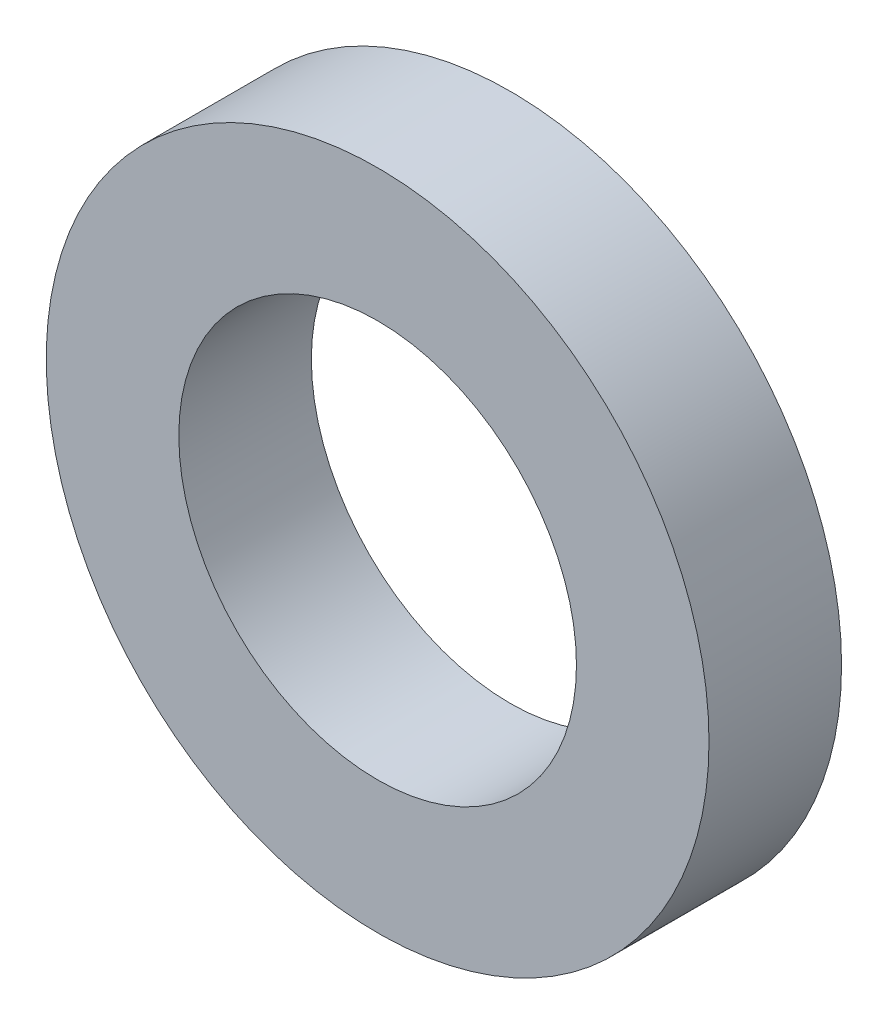
ISO-10303-21;
HEADER;
FILE_DESCRIPTION(('STEP AP214'),'2;1');
FILE_NAME('part.step','',(''),(''),'','','');
FILE_SCHEMA(('AUTOMOTIVE_DESIGN { 1 0 10303 214 1 1 1 1 }'));
ENDSEC;
DATA;
#1=APPLICATION_CONTEXT('core data for automotive mechanical design processes');
#2=APPLICATION_PROTOCOL_DEFINITION('international standard','automotive_design',2000,#1);
#3=PRODUCT_CONTEXT('',#1,'mechanical');
#4=PRODUCT('Part','Part','',(#3));
#5=PRODUCT_RELATED_PRODUCT_CATEGORY('part','',(#4));
#6=PRODUCT_DEFINITION_FORMATION('','',#4);
#7=PRODUCT_DEFINITION_CONTEXT('part definition',#1,'design');
#8=PRODUCT_DEFINITION('design','',#6,#7);
#9=PRODUCT_DEFINITION_SHAPE('','',#8);
#10=(LENGTH_UNIT() NAMED_UNIT(*) SI_UNIT(.MILLI.,.METRE.));
#11=(NAMED_UNIT(*) PLANE_ANGLE_UNIT() SI_UNIT($,.RADIAN.));
#12=(NAMED_UNIT(*) SI_UNIT($,.STERADIAN.) SOLID_ANGLE_UNIT());
#13=UNCERTAINTY_MEASURE_WITH_UNIT(LENGTH_MEASURE(1.E-05),#10,'distance_accuracy_value','');
#14=(GEOMETRIC_REPRESENTATION_CONTEXT(3) GLOBAL_UNCERTAINTY_ASSIGNED_CONTEXT((#13)) GLOBAL_UNIT_ASSIGNED_CONTEXT((#10,
#11,#12)) REPRESENTATION_CONTEXT('',''));
#15=CARTESIAN_POINT('',(0.,0.,0.));
#16=DIRECTION('',(0.,0.,1.));
#17=DIRECTION('',(1.,0.,0.));
#18=AXIS2_PLACEMENT_3D('',#15,#16,#17);
#19=CARTESIAN_POINT('',(0.,0.,1.));
#20=DIRECTION('',(0.,0.,1.));
#21=DIRECTION('',(1.,0.,0.));
#22=AXIS2_PLACEMENT_3D('',#19,#20,#21);
#23=PLANE('',#22);
#24=CARTESIAN_POINT('',(0.,0.,1.));
#25=DIRECTION('',(0.,0.,1.));
#26=DIRECTION('',(1.,0.,0.));
#27=AXIS2_PLACEMENT_3D('',#24,#25,#26);
#28=CIRCLE('',#27,2.5);
#29=CARTESIAN_POINT('',(2.5,0.,1.));
#30=VERTEX_POINT('',#29);
#31=EDGE_CURVE('E10',#30,#30,#28,.T.);
#32=ORIENTED_EDGE('',*,*,#31,.T.);
#33=EDGE_LOOP('',(#32));
#34=FACE_BOUND('',#33,.T.);
#35=CARTESIAN_POINT('',(0.,0.,1.));
#36=DIRECTION('',(0.,0.,1.));
#37=DIRECTION('',(1.,0.,0.));
#38=AXIS2_PLACEMENT_3D('',#35,#36,#37);
#39=CIRCLE('',#38,1.5);
#40=CARTESIAN_POINT('',(1.5,0.,1.));
#41=VERTEX_POINT('',#40);
#42=EDGE_CURVE('E56',#41,#41,#39,.T.);
#43=ORIENTED_EDGE('',*,*,#42,.F.);
#44=EDGE_LOOP('',(#43));
#45=FACE_BOUND('',#44,.T.);
#46=ADVANCED_FACE('F43',(#34,#45),#23,.T.);
#47=CARTESIAN_POINT('',(0.,0.,0.));
#48=DIRECTION('',(0.,0.,1.));
#49=DIRECTION('',(1.,0.,0.));
#50=AXIS2_PLACEMENT_3D('',#47,#48,#49);
#51=PLANE('',#50);
#52=CARTESIAN_POINT('',(0.,0.,0.));
#53=DIRECTION('',(0.,0.,1.));
#54=DIRECTION('',(1.,0.,0.));
#55=AXIS2_PLACEMENT_3D('',#52,#53,#54);
#56=CIRCLE('',#55,2.5);
#57=CARTESIAN_POINT('',(2.5,0.,0.));
#58=VERTEX_POINT('',#57);
#59=EDGE_CURVE('E47',#58,#58,#56,.T.);
#60=ORIENTED_EDGE('',*,*,#59,.F.);
#61=EDGE_LOOP('',(#60));
#62=FACE_BOUND('',#61,.T.);
#63=CARTESIAN_POINT('',(0.,0.,0.));
#64=DIRECTION('',(0.,0.,1.));
#65=DIRECTION('',(1.,0.,0.));
#66=AXIS2_PLACEMENT_3D('',#63,#64,#65);
#67=CIRCLE('',#66,1.5);
#68=CARTESIAN_POINT('',(1.5,0.,0.));
#69=VERTEX_POINT('',#68);
#70=EDGE_CURVE('E58',#69,#69,#67,.T.);
#71=ORIENTED_EDGE('',*,*,#70,.T.);
#72=EDGE_LOOP('',(#71));
#73=FACE_BOUND('',#72,.T.);
#74=ADVANCED_FACE('F70',(#62,#73),#51,.F.);
#75=CARTESIAN_POINT('',(0.,0.,1.));
#76=DIRECTION('',(0.,0.,-1.));
#77=DIRECTION('',(-1.,0.,0.));
#78=AXIS2_PLACEMENT_3D('',#75,#76,#77);
#79=CYLINDRICAL_SURFACE('',#78,2.5);
#80=ORIENTED_EDGE('',*,*,#31,.F.);
#81=EDGE_LOOP('',(#80));
#82=FACE_BOUND('',#81,.T.);
#83=ORIENTED_EDGE('',*,*,#59,.T.);
#84=EDGE_LOOP('',(#83));
#85=FACE_BOUND('',#84,.T.);
#86=ADVANCED_FACE('F45',(#82,#85),#79,.T.);
#87=CARTESIAN_POINT('',(0.,0.,1.));
#88=DIRECTION('',(0.,0.,-1.));
#89=DIRECTION('',(-1.,0.,0.));
#90=AXIS2_PLACEMENT_3D('',#87,#88,#89);
#91=CYLINDRICAL_SURFACE('',#90,1.5);
#92=ORIENTED_EDGE('',*,*,#42,.T.);
#93=EDGE_LOOP('',(#92));
#94=FACE_BOUND('',#93,.T.);
#95=ORIENTED_EDGE('',*,*,#70,.F.);
#96=EDGE_LOOP('',(#95));
#97=FACE_BOUND('',#96,.T.);
#98=ADVANCED_FACE('F66',(#94,#97),#91,.F.);
#99=CLOSED_SHELL('',(#46,#74,#86,#98));
#100=MANIFOLD_SOLID_BREP('B2',#99);
#101=ADVANCED_BREP_SHAPE_REPRESENTATION('',(#18,#100),#14);
#102=SHAPE_DEFINITION_REPRESENTATION(#9,#101);
ENDSEC;
END-ISO-10303-21;
